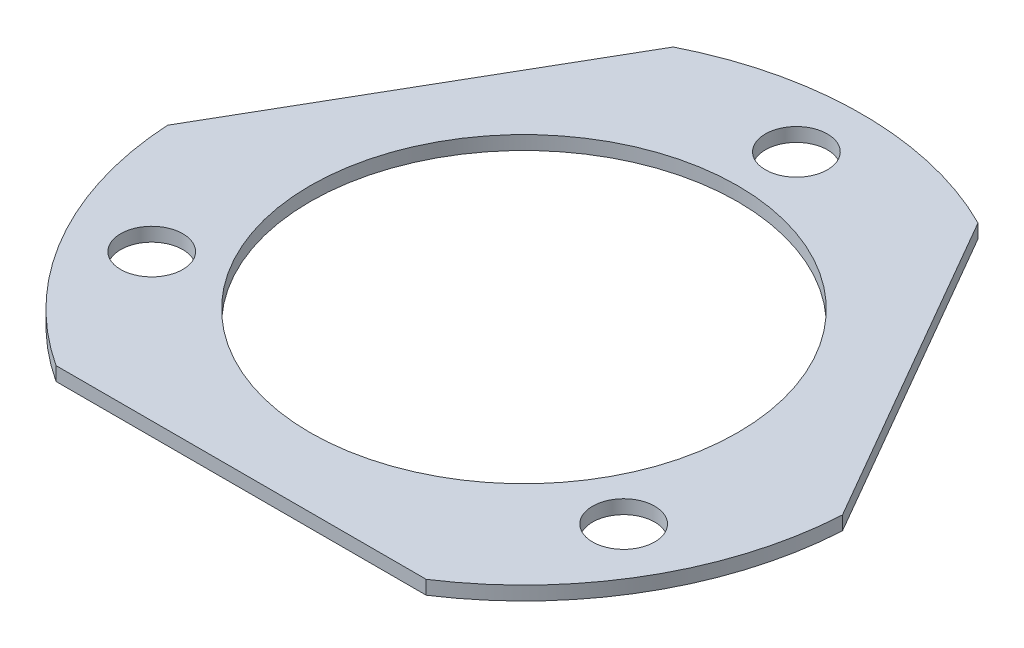
ISO-10303-21;
HEADER;
FILE_DESCRIPTION(('STEP AP214'),'2;1');
FILE_NAME('part.step','',(''),(''),'','','');
FILE_SCHEMA(('AUTOMOTIVE_DESIGN { 1 0 10303 214 1 1 1 1 }'));
ENDSEC;
DATA;
#1=APPLICATION_CONTEXT('core data for automotive mechanical design processes');
#2=APPLICATION_PROTOCOL_DEFINITION('international standard','automotive_design',2000,#1);
#3=PRODUCT_CONTEXT('',#1,'mechanical');
#4=PRODUCT('Part','Part','',(#3));
#5=PRODUCT_RELATED_PRODUCT_CATEGORY('part','',(#4));
#6=PRODUCT_DEFINITION_FORMATION('','',#4);
#7=PRODUCT_DEFINITION_CONTEXT('part definition',#1,'design');
#8=PRODUCT_DEFINITION('design','',#6,#7);
#9=PRODUCT_DEFINITION_SHAPE('','',#8);
#10=(LENGTH_UNIT() NAMED_UNIT(*) SI_UNIT(.MILLI.,.METRE.));
#11=(NAMED_UNIT(*) PLANE_ANGLE_UNIT() SI_UNIT($,.RADIAN.));
#12=(NAMED_UNIT(*) SI_UNIT($,.STERADIAN.) SOLID_ANGLE_UNIT());
#13=UNCERTAINTY_MEASURE_WITH_UNIT(LENGTH_MEASURE(1.E-05),#10,'distance_accuracy_value','');
#14=(GEOMETRIC_REPRESENTATION_CONTEXT(3) GLOBAL_UNCERTAINTY_ASSIGNED_CONTEXT((#13)) GLOBAL_UNIT_ASSIGNED_CONTEXT((#10,
#11,#12)) REPRESENTATION_CONTEXT('',''));
#15=CARTESIAN_POINT('',(0.,0.,0.));
#16=DIRECTION('',(0.,0.,1.));
#17=DIRECTION('',(1.,0.,0.));
#18=AXIS2_PLACEMENT_3D('',#15,#16,#17);
#19=CARTESIAN_POINT('',(0.,-2.,0.));
#20=DIRECTION('',(0.,1.,0.));
#21=DIRECTION('',(0.,0.,1.));
#22=AXIS2_PLACEMENT_3D('',#19,#20,#21);
#23=CYLINDRICAL_SURFACE('',#22,49.);
#24=CARTESIAN_POINT('',(0.,0.,0.));
#25=DIRECTION('',(0.,1.,0.));
#26=DIRECTION('',(0.,0.,1.));
#27=AXIS2_PLACEMENT_3D('',#24,#25,#26);
#28=CIRCLE('',#27,49.);
#29=CARTESIAN_POINT('',(-48.9234494201607,0.,2.73790007724449));
#30=VERTEX_POINT('',#29);
#31=CARTESIAN_POINT('',(-26.8328157299975,0.,41.));
#32=VERTEX_POINT('',#31);
#33=EDGE_CURVE('E126',#30,#32,#28,.T.);
#34=ORIENTED_EDGE('',*,*,#33,.F.);
#35=DIRECTION('',(0.,1.,0.));
#36=VECTOR('',#35,1.);
#37=CARTESIAN_POINT('',(-48.9234494201607,-2.,2.73790007724449));
#38=LINE('',#37,#36);
#39=CARTESIAN_POINT('',(-48.9234494201607,-2.,2.73790007724449));
#40=VERTEX_POINT('',#39);
#41=EDGE_CURVE('E11',#40,#30,#38,.T.);
#42=ORIENTED_EDGE('',*,*,#41,.F.);
#43=CARTESIAN_POINT('',(0.,-2.,0.));
#44=DIRECTION('',(0.,1.,0.));
#45=DIRECTION('',(0.,0.,1.));
#46=AXIS2_PLACEMENT_3D('',#43,#44,#45);
#47=CIRCLE('',#46,49.);
#48=CARTESIAN_POINT('',(-26.8328157299975,-2.,41.));
#49=VERTEX_POINT('',#48);
#50=EDGE_CURVE('E141',#40,#49,#47,.T.);
#51=ORIENTED_EDGE('',*,*,#50,.T.);
#52=DIRECTION('',(0.,1.,0.));
#53=VECTOR('',#52,1.);
#54=CARTESIAN_POINT('',(-26.8328157299975,-2.,41.));
#55=LINE('',#54,#53);
#56=EDGE_CURVE('E44',#49,#32,#55,.T.);
#57=ORIENTED_EDGE('',*,*,#56,.T.);
#58=EDGE_LOOP('',(#34,#42,#51,#57));
#59=FACE_BOUND('',#58,.T.);
#60=ADVANCED_FACE('F41',(#59),#23,.T.);
#61=CARTESIAN_POINT('',(-22.0906336901632,-2.,-43.7379000772445));
#62=DIRECTION('',(-0.866025403784439,0.,-0.5));
#63=DIRECTION('',(-0.5,0.,0.866025403784439));
#64=AXIS2_PLACEMENT_3D('',#61,#62,#63);
#65=PLANE('',#64);
#66=DIRECTION('',(-0.5,0.,0.866025403784439));
#67=VECTOR('',#66,1.);
#68=CARTESIAN_POINT('',(-22.0906336901632,0.,-43.7379000772445));
#69=LINE('',#68,#67);
#70=CARTESIAN_POINT('',(-22.0906336901632,0.,-43.7379000772445));
#71=VERTEX_POINT('',#70);
#72=EDGE_CURVE('E139',#71,#30,#69,.T.);
#73=ORIENTED_EDGE('',*,*,#72,.F.);
#74=DIRECTION('',(0.,1.,0.));
#75=VECTOR('',#74,1.);
#76=CARTESIAN_POINT('',(-22.0906336901632,-2.,-43.7379000772445));
#77=LINE('',#76,#75);
#78=CARTESIAN_POINT('',(-22.0906336901632,-2.,-43.7379000772445));
#79=VERTEX_POINT('',#78);
#80=EDGE_CURVE('E50',#79,#71,#77,.T.);
#81=ORIENTED_EDGE('',*,*,#80,.F.);
#82=DIRECTION('',(-0.5,0.,0.866025403784439));
#83=VECTOR('',#82,1.);
#84=CARTESIAN_POINT('',(-22.0906336901632,-2.,-43.7379000772445));
#85=LINE('',#84,#83);
#86=EDGE_CURVE('E116',#79,#40,#85,.T.);
#87=ORIENTED_EDGE('',*,*,#86,.T.);
#88=ORIENTED_EDGE('',*,*,#41,.T.);
#89=EDGE_LOOP('',(#73,#81,#87,#88));
#90=FACE_BOUND('',#89,.T.);
#91=ADVANCED_FACE('F149',(#90),#65,.T.);
#92=CARTESIAN_POINT('',(0.,-2.,0.));
#93=DIRECTION('',(0.,1.,0.));
#94=DIRECTION('',(0.,0.,1.));
#95=AXIS2_PLACEMENT_3D('',#92,#93,#94);
#96=CYLINDRICAL_SURFACE('',#95,49.);
#97=CARTESIAN_POINT('',(0.,0.,0.));
#98=DIRECTION('',(0.,1.,0.));
#99=DIRECTION('',(0.,0.,1.));
#100=AXIS2_PLACEMENT_3D('',#97,#98,#99);
#101=CIRCLE('',#100,49.);
#102=CARTESIAN_POINT('',(22.0906336901632,0.,-43.7379000772445));
#103=VERTEX_POINT('',#102);
#104=EDGE_CURVE('E103',#103,#71,#101,.T.);
#105=ORIENTED_EDGE('',*,*,#104,.F.);
#106=DIRECTION('',(0.,1.,0.));
#107=VECTOR('',#106,1.);
#108=CARTESIAN_POINT('',(22.0906336901632,-2.,-43.7379000772445));
#109=LINE('',#108,#107);
#110=CARTESIAN_POINT('',(22.0906336901632,-2.,-43.7379000772445));
#111=VERTEX_POINT('',#110);
#112=EDGE_CURVE('E98',#111,#103,#109,.T.);
#113=ORIENTED_EDGE('',*,*,#112,.F.);
#114=CARTESIAN_POINT('',(0.,-2.,0.));
#115=DIRECTION('',(0.,1.,0.));
#116=DIRECTION('',(0.,0.,1.));
#117=AXIS2_PLACEMENT_3D('',#114,#115,#116);
#118=CIRCLE('',#117,49.);
#119=EDGE_CURVE('E101',#111,#79,#118,.T.);
#120=ORIENTED_EDGE('',*,*,#119,.T.);
#121=ORIENTED_EDGE('',*,*,#80,.T.);
#122=EDGE_LOOP('',(#105,#113,#120,#121));
#123=FACE_BOUND('',#122,.T.);
#124=ADVANCED_FACE('F100',(#123),#96,.T.);
#125=CARTESIAN_POINT('',(48.9234494201607,-2.,2.73790007724449));
#126=DIRECTION('',(0.866025403784439,0.,-0.5));
#127=DIRECTION('',(-0.5,0.,-0.866025403784438));
#128=AXIS2_PLACEMENT_3D('',#125,#126,#127);
#129=PLANE('',#128);
#130=DIRECTION('',(-0.5,0.,-0.866025403784438));
#131=VECTOR('',#130,1.);
#132=CARTESIAN_POINT('',(48.9234494201607,0.,2.73790007724449));
#133=LINE('',#132,#131);
#134=CARTESIAN_POINT('',(48.9234494201607,0.,2.73790007724449));
#135=VERTEX_POINT('',#134);
#136=EDGE_CURVE('E136',#135,#103,#133,.T.);
#137=ORIENTED_EDGE('',*,*,#136,.F.);
#138=DIRECTION('',(0.,1.,0.));
#139=VECTOR('',#138,1.);
#140=CARTESIAN_POINT('',(48.9234494201607,-2.,2.73790007724449));
#141=LINE('',#140,#139);
#142=CARTESIAN_POINT('',(48.9234494201607,-2.,2.73790007724449));
#143=VERTEX_POINT('',#142);
#144=EDGE_CURVE('E108',#143,#135,#141,.T.);
#145=ORIENTED_EDGE('',*,*,#144,.F.);
#146=DIRECTION('',(-0.5,0.,-0.866025403784438));
#147=VECTOR('',#146,1.);
#148=CARTESIAN_POINT('',(48.9234494201607,-2.,2.73790007724449));
#149=LINE('',#148,#147);
#150=EDGE_CURVE('E114',#143,#111,#149,.T.);
#151=ORIENTED_EDGE('',*,*,#150,.T.);
#152=ORIENTED_EDGE('',*,*,#112,.T.);
#153=EDGE_LOOP('',(#137,#145,#151,#152));
#154=FACE_BOUND('',#153,.T.);
#155=ADVANCED_FACE('F118',(#154),#129,.T.);
#156=CARTESIAN_POINT('',(0.,-2.,0.));
#157=DIRECTION('',(0.,1.,0.));
#158=DIRECTION('',(0.,0.,1.));
#159=AXIS2_PLACEMENT_3D('',#156,#157,#158);
#160=CYLINDRICAL_SURFACE('',#159,49.);
#161=CARTESIAN_POINT('',(0.,0.,0.));
#162=DIRECTION('',(0.,1.,0.));
#163=DIRECTION('',(0.,0.,1.));
#164=AXIS2_PLACEMENT_3D('',#161,#162,#163);
#165=CIRCLE('',#164,49.);
#166=CARTESIAN_POINT('',(26.8328157299975,0.,41.));
#167=VERTEX_POINT('',#166);
#168=EDGE_CURVE('E133',#167,#135,#165,.T.);
#169=ORIENTED_EDGE('',*,*,#168,.F.);
#170=DIRECTION('',(0.,1.,0.));
#171=VECTOR('',#170,1.);
#172=CARTESIAN_POINT('',(26.8328157299975,-2.,41.));
#173=LINE('',#172,#171);
#174=CARTESIAN_POINT('',(26.8328157299975,-2.,41.));
#175=VERTEX_POINT('',#174);
#176=EDGE_CURVE('E144',#175,#167,#173,.T.);
#177=ORIENTED_EDGE('',*,*,#176,.F.);
#178=CARTESIAN_POINT('',(0.,-2.,0.));
#179=DIRECTION('',(0.,1.,0.));
#180=DIRECTION('',(0.,0.,1.));
#181=AXIS2_PLACEMENT_3D('',#178,#179,#180);
#182=CIRCLE('',#181,49.);
#183=EDGE_CURVE('E119',#175,#143,#182,.T.);
#184=ORIENTED_EDGE('',*,*,#183,.T.);
#185=ORIENTED_EDGE('',*,*,#144,.T.);
#186=EDGE_LOOP('',(#169,#177,#184,#185));
#187=FACE_BOUND('',#186,.T.);
#188=ADVANCED_FACE('F162',(#187),#160,.T.);
#189=CARTESIAN_POINT('',(-26.8328157299975,-2.,41.));
#190=DIRECTION('',(0.,0.,1.));
#191=DIRECTION('',(1.,0.,0.));
#192=AXIS2_PLACEMENT_3D('',#189,#190,#191);
#193=PLANE('',#192);
#194=DIRECTION('',(1.,0.,0.));
#195=VECTOR('',#194,1.);
#196=CARTESIAN_POINT('',(-26.8328157299975,0.,41.));
#197=LINE('',#196,#195);
#198=EDGE_CURVE('E129',#32,#167,#197,.T.);
#199=ORIENTED_EDGE('',*,*,#198,.F.);
#200=ORIENTED_EDGE('',*,*,#56,.F.);
#201=DIRECTION('',(1.,0.,0.));
#202=VECTOR('',#201,1.);
#203=CARTESIAN_POINT('',(-26.8328157299975,-2.,41.));
#204=LINE('',#203,#202);
#205=EDGE_CURVE('E121',#49,#175,#204,.T.);
#206=ORIENTED_EDGE('',*,*,#205,.T.);
#207=ORIENTED_EDGE('',*,*,#176,.T.);
#208=EDGE_LOOP('',(#199,#200,#206,#207));
#209=FACE_BOUND('',#208,.T.);
#210=ADVANCED_FACE('F146',(#209),#193,.T.);
#211=CARTESIAN_POINT('',(0.,-2.,0.));
#212=DIRECTION('',(0.,1.,0.));
#213=DIRECTION('',(0.,0.,1.));
#214=AXIS2_PLACEMENT_3D('',#211,#212,#213);
#215=PLANE('',#214);
#216=CARTESIAN_POINT('',(-34.2080034494853,-2.,19.75));
#217=DIRECTION('',(0.,1.,0.));
#218=DIRECTION('',(0.,0.,1.));
#219=AXIS2_PLACEMENT_3D('',#216,#217,#218);
#220=CIRCLE('',#219,4.5);
#221=CARTESIAN_POINT('',(-34.2080034494853,-2.,24.25));
#222=VERTEX_POINT('',#221);
#223=EDGE_CURVE('E196',#222,#222,#220,.T.);
#224=ORIENTED_EDGE('',*,*,#223,.T.);
#225=EDGE_LOOP('',(#224));
#226=FACE_BOUND('',#225,.T.);
#227=CARTESIAN_POINT('',(34.2080034494853,-2.,19.75));
#228=DIRECTION('',(0.,1.,0.));
#229=DIRECTION('',(0.,0.,1.));
#230=AXIS2_PLACEMENT_3D('',#227,#228,#229);
#231=CIRCLE('',#230,4.5);
#232=CARTESIAN_POINT('',(34.2080034494853,-2.,24.25));
#233=VERTEX_POINT('',#232);
#234=EDGE_CURVE('E204',#233,#233,#231,.T.);
#235=ORIENTED_EDGE('',*,*,#234,.T.);
#236=EDGE_LOOP('',(#235));
#237=FACE_BOUND('',#236,.T.);
#238=CARTESIAN_POINT('',(0.,-2.,-39.5));
#239=DIRECTION('',(0.,1.,0.));
#240=DIRECTION('',(0.,0.,1.));
#241=AXIS2_PLACEMENT_3D('',#238,#239,#240);
#242=CIRCLE('',#241,4.5);
#243=CARTESIAN_POINT('',(0.,-2.,-35.));
#244=VERTEX_POINT('',#243);
#245=EDGE_CURVE('E210',#244,#244,#242,.T.);
#246=ORIENTED_EDGE('',*,*,#245,.T.);
#247=EDGE_LOOP('',(#246));
#248=FACE_BOUND('',#247,.T.);
#249=CARTESIAN_POINT('',(0.,-2.,0.));
#250=DIRECTION('',(0.,1.,0.));
#251=DIRECTION('',(0.,0.,1.));
#252=AXIS2_PLACEMENT_3D('',#249,#250,#251);
#253=CIRCLE('',#252,31.);
#254=CARTESIAN_POINT('',(0.,-2.,31.));
#255=VERTEX_POINT('',#254);
#256=EDGE_CURVE('E130',#255,#255,#253,.T.);
#257=ORIENTED_EDGE('',*,*,#256,.T.);
#258=EDGE_LOOP('',(#257));
#259=FACE_BOUND('',#258,.T.);
#260=ORIENTED_EDGE('',*,*,#50,.F.);
#261=ORIENTED_EDGE('',*,*,#86,.F.);
#262=ORIENTED_EDGE('',*,*,#119,.F.);
#263=ORIENTED_EDGE('',*,*,#150,.F.);
#264=ORIENTED_EDGE('',*,*,#183,.F.);
#265=ORIENTED_EDGE('',*,*,#205,.F.);
#266=EDGE_LOOP('',(#260,#261,#262,#263,#264,#265));
#267=FACE_BOUND('',#266,.T.);
#268=ADVANCED_FACE('F112',(#226,#237,#248,#259,#267),#215,.F.);
#269=CARTESIAN_POINT('',(0.,0.,0.));
#270=DIRECTION('',(0.,1.,0.));
#271=DIRECTION('',(0.,0.,1.));
#272=AXIS2_PLACEMENT_3D('',#269,#270,#271);
#273=PLANE('',#272);
#274=CARTESIAN_POINT('',(-34.2080034494853,0.,19.75));
#275=DIRECTION('',(0.,1.,0.));
#276=DIRECTION('',(0.,0.,1.));
#277=AXIS2_PLACEMENT_3D('',#274,#275,#276);
#278=CIRCLE('',#277,4.5);
#279=CARTESIAN_POINT('',(-34.2080034494853,0.,24.25));
#280=VERTEX_POINT('',#279);
#281=EDGE_CURVE('E199',#280,#280,#278,.T.);
#282=ORIENTED_EDGE('',*,*,#281,.F.);
#283=EDGE_LOOP('',(#282));
#284=FACE_BOUND('',#283,.T.);
#285=CARTESIAN_POINT('',(34.2080034494853,0.,19.75));
#286=DIRECTION('',(0.,1.,0.));
#287=DIRECTION('',(0.,0.,1.));
#288=AXIS2_PLACEMENT_3D('',#285,#286,#287);
#289=CIRCLE('',#288,4.5);
#290=CARTESIAN_POINT('',(34.2080034494853,0.,24.25));
#291=VERTEX_POINT('',#290);
#292=EDGE_CURVE('E201',#291,#291,#289,.T.);
#293=ORIENTED_EDGE('',*,*,#292,.F.);
#294=EDGE_LOOP('',(#293));
#295=FACE_BOUND('',#294,.T.);
#296=CARTESIAN_POINT('',(0.,0.,-39.5));
#297=DIRECTION('',(0.,1.,0.));
#298=DIRECTION('',(0.,0.,1.));
#299=AXIS2_PLACEMENT_3D('',#296,#297,#298);
#300=CIRCLE('',#299,4.5);
#301=CARTESIAN_POINT('',(0.,0.,-35.));
#302=VERTEX_POINT('',#301);
#303=EDGE_CURVE('E207',#302,#302,#300,.T.);
#304=ORIENTED_EDGE('',*,*,#303,.F.);
#305=EDGE_LOOP('',(#304));
#306=FACE_BOUND('',#305,.T.);
#307=CARTESIAN_POINT('',(0.,0.,0.));
#308=DIRECTION('',(0.,1.,0.));
#309=DIRECTION('',(0.,0.,1.));
#310=AXIS2_PLACEMENT_3D('',#307,#308,#309);
#311=CIRCLE('',#310,31.);
#312=CARTESIAN_POINT('',(0.,0.,31.));
#313=VERTEX_POINT('',#312);
#314=EDGE_CURVE('E213',#313,#313,#311,.T.);
#315=ORIENTED_EDGE('',*,*,#314,.F.);
#316=EDGE_LOOP('',(#315));
#317=FACE_BOUND('',#316,.T.);
#318=ORIENTED_EDGE('',*,*,#33,.T.);
#319=ORIENTED_EDGE('',*,*,#198,.T.);
#320=ORIENTED_EDGE('',*,*,#168,.T.);
#321=ORIENTED_EDGE('',*,*,#136,.T.);
#322=ORIENTED_EDGE('',*,*,#104,.T.);
#323=ORIENTED_EDGE('',*,*,#72,.T.);
#324=EDGE_LOOP('',(#318,#319,#320,#321,#322,#323));
#325=FACE_BOUND('',#324,.T.);
#326=ADVANCED_FACE('F148',(#284,#295,#306,#317,#325),#273,.T.);
#327=CARTESIAN_POINT('',(0.,-2.,0.));
#328=DIRECTION('',(0.,1.,0.));
#329=DIRECTION('',(0.,0.,1.));
#330=AXIS2_PLACEMENT_3D('',#327,#328,#329);
#331=CYLINDRICAL_SURFACE('',#330,31.);
#332=ORIENTED_EDGE('',*,*,#256,.F.);
#333=EDGE_LOOP('',(#332));
#334=FACE_BOUND('',#333,.T.);
#335=ORIENTED_EDGE('',*,*,#314,.T.);
#336=EDGE_LOOP('',(#335));
#337=FACE_BOUND('',#336,.T.);
#338=ADVANCED_FACE('F173',(#334,#337),#331,.F.);
#339=CARTESIAN_POINT('',(0.,-2.,-39.5));
#340=DIRECTION('',(0.,1.,0.));
#341=DIRECTION('',(0.,0.,1.));
#342=AXIS2_PLACEMENT_3D('',#339,#340,#341);
#343=CYLINDRICAL_SURFACE('',#342,4.5);
#344=ORIENTED_EDGE('',*,*,#245,.F.);
#345=EDGE_LOOP('',(#344));
#346=FACE_BOUND('',#345,.T.);
#347=ORIENTED_EDGE('',*,*,#303,.T.);
#348=EDGE_LOOP('',(#347));
#349=FACE_BOUND('',#348,.T.);
#350=ADVANCED_FACE('F180',(#346,#349),#343,.F.);
#351=CARTESIAN_POINT('',(34.2080034494853,-2.,19.75));
#352=DIRECTION('',(0.,1.,0.));
#353=DIRECTION('',(0.,0.,1.));
#354=AXIS2_PLACEMENT_3D('',#351,#352,#353);
#355=CYLINDRICAL_SURFACE('',#354,4.5);
#356=ORIENTED_EDGE('',*,*,#234,.F.);
#357=EDGE_LOOP('',(#356));
#358=FACE_BOUND('',#357,.T.);
#359=ORIENTED_EDGE('',*,*,#292,.T.);
#360=EDGE_LOOP('',(#359));
#361=FACE_BOUND('',#360,.T.);
#362=ADVANCED_FACE('F184',(#358,#361),#355,.F.);
#363=CARTESIAN_POINT('',(-34.2080034494853,-2.,19.75));
#364=DIRECTION('',(0.,1.,0.));
#365=DIRECTION('',(0.,0.,1.));
#366=AXIS2_PLACEMENT_3D('',#363,#364,#365);
#367=CYLINDRICAL_SURFACE('',#366,4.5);
#368=ORIENTED_EDGE('',*,*,#223,.F.);
#369=EDGE_LOOP('',(#368));
#370=FACE_BOUND('',#369,.T.);
#371=ORIENTED_EDGE('',*,*,#281,.T.);
#372=EDGE_LOOP('',(#371));
#373=FACE_BOUND('',#372,.T.);
#374=ADVANCED_FACE('F188',(#370,#373),#367,.F.);
#375=CLOSED_SHELL('',(#60,#91,#124,#155,#188,#210,#268,#326,#338,#350,#362,#374));
#376=MANIFOLD_SOLID_BREP('B2',#375);
#377=ADVANCED_BREP_SHAPE_REPRESENTATION('',(#18,#376),#14);
#378=SHAPE_DEFINITION_REPRESENTATION(#9,#377);
ENDSEC;
END-ISO-10303-21;
